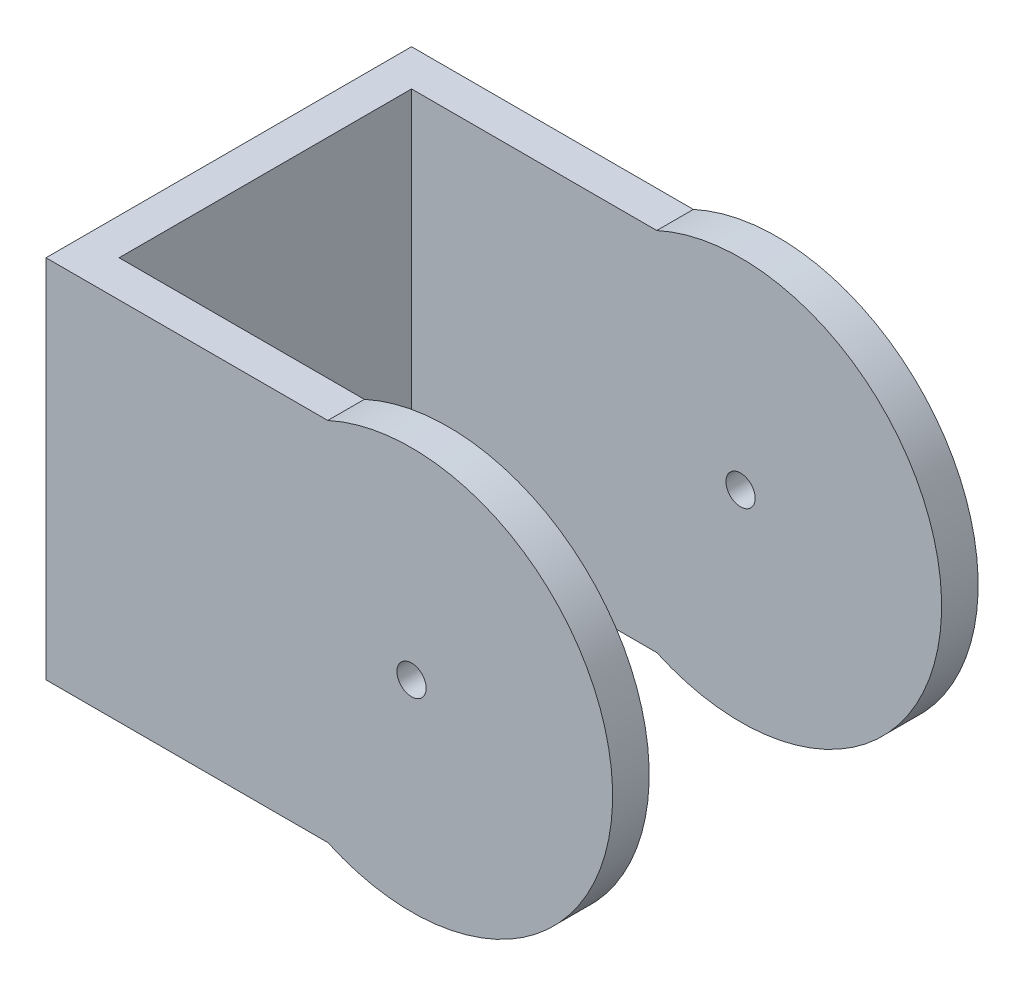
ISO-10303-21;
HEADER;
FILE_DESCRIPTION(('STEP AP214'),'2;1');
FILE_NAME('part.step','',(''),(''),'','','');
FILE_SCHEMA(('AUTOMOTIVE_DESIGN { 1 0 10303 214 1 1 1 1 }'));
ENDSEC;
DATA;
#1=APPLICATION_CONTEXT('core data for automotive mechanical design processes');
#2=APPLICATION_PROTOCOL_DEFINITION('international standard','automotive_design',2000,#1);
#3=PRODUCT_CONTEXT('',#1,'mechanical');
#4=PRODUCT('Part','Part','',(#3));
#5=PRODUCT_RELATED_PRODUCT_CATEGORY('part','',(#4));
#6=PRODUCT_DEFINITION_FORMATION('','',#4);
#7=PRODUCT_DEFINITION_CONTEXT('part definition',#1,'design');
#8=PRODUCT_DEFINITION('design','',#6,#7);
#9=PRODUCT_DEFINITION_SHAPE('','',#8);
#10=(LENGTH_UNIT() NAMED_UNIT(*) SI_UNIT(.MILLI.,.METRE.));
#11=(NAMED_UNIT(*) PLANE_ANGLE_UNIT() SI_UNIT($,.RADIAN.));
#12=(NAMED_UNIT(*) SI_UNIT($,.STERADIAN.) SOLID_ANGLE_UNIT());
#13=UNCERTAINTY_MEASURE_WITH_UNIT(LENGTH_MEASURE(1.E-05),#10,'distance_accuracy_value','');
#14=(GEOMETRIC_REPRESENTATION_CONTEXT(3) GLOBAL_UNCERTAINTY_ASSIGNED_CONTEXT((#13)) GLOBAL_UNIT_ASSIGNED_CONTEXT((#10,
#11,#12)) REPRESENTATION_CONTEXT('',''));
#15=CARTESIAN_POINT('',(0.,0.,0.));
#16=DIRECTION('',(0.,0.,1.));
#17=DIRECTION('',(1.,0.,0.));
#18=AXIS2_PLACEMENT_3D('',#15,#16,#17);
#19=CARTESIAN_POINT('',(-9.,0.,0.));
#20=DIRECTION('',(1.,0.,0.));
#21=DIRECTION('',(0.,1.,0.));
#22=AXIS2_PLACEMENT_3D('',#19,#20,#21);
#23=PLANE('',#22);
#24=CARTESIAN_POINT('',(-9.,0.,5.));
#25=DIRECTION('',(1.,0.,0.));
#26=DIRECTION('',(0.,1.,0.));
#27=AXIS2_PLACEMENT_3D('',#24,#25,#26);
#28=CIRCLE('',#27,0.4);
#29=CARTESIAN_POINT('',(-9.,0.399999999999999,5.));
#30=VERTEX_POINT('',#29);
#31=EDGE_CURVE('E323',#30,#30,#28,.T.);
#32=ORIENTED_EDGE('',*,*,#31,.F.);
#33=EDGE_LOOP('',(#32));
#34=FACE_BOUND('',#33,.T.);
#35=DIRECTION('',(0.,0.,1.));
#36=VECTOR('',#35,1.);
#37=CARTESIAN_POINT('',(-9.,-5.,10.));
#38=LINE('',#37,#36);
#39=CARTESIAN_POINT('',(-9.,-5.,0.999999999999999));
#40=VERTEX_POINT('',#39);
#41=CARTESIAN_POINT('',(-9.,-5.,9.));
#42=VERTEX_POINT('',#41);
#43=EDGE_CURVE('E133',#40,#42,#38,.T.);
#44=ORIENTED_EDGE('',*,*,#43,.F.);
#45=DIRECTION('',(0.,1.,0.));
#46=VECTOR('',#45,1.);
#47=CARTESIAN_POINT('',(-9.,0.,1.));
#48=LINE('',#47,#46);
#49=CARTESIAN_POINT('',(-9.,5.,1.));
#50=VERTEX_POINT('',#49);
#51=EDGE_CURVE('E11',#40,#50,#48,.T.);
#52=ORIENTED_EDGE('',*,*,#51,.T.);
#53=DIRECTION('',(0.,0.,-1.));
#54=VECTOR('',#53,1.);
#55=CARTESIAN_POINT('',(-9.,5.,0.));
#56=LINE('',#55,#54);
#57=CARTESIAN_POINT('',(-9.,5.,9.));
#58=VERTEX_POINT('',#57);
#59=EDGE_CURVE('E119',#58,#50,#56,.T.);
#60=ORIENTED_EDGE('',*,*,#59,.F.);
#61=DIRECTION('',(0.,1.,0.));
#62=VECTOR('',#61,1.);
#63=CARTESIAN_POINT('',(-9.,7.5,9.));
#64=LINE('',#63,#62);
#65=EDGE_CURVE('E46',#42,#58,#64,.T.);
#66=ORIENTED_EDGE('',*,*,#65,.F.);
#67=EDGE_LOOP('',(#44,#52,#60,#66));
#68=FACE_BOUND('',#67,.T.);
#69=ADVANCED_FACE('F38',(#34,#68),#23,.T.);
#70=CARTESIAN_POINT('',(0.,-5.,10.));
#71=DIRECTION('',(0.,1.,0.));
#72=DIRECTION('',(0.,0.,1.));
#73=AXIS2_PLACEMENT_3D('',#70,#71,#72);
#74=PLANE('',#73);
#75=DIRECTION('',(-1.,0.,0.));
#76=VECTOR('',#75,1.);
#77=CARTESIAN_POINT('',(-9.,-5.,0.));
#78=LINE('',#77,#76);
#79=CARTESIAN_POINT('',(-2.29128784747792,-5.,0.));
#80=VERTEX_POINT('',#79);
#81=CARTESIAN_POINT('',(-10.,-5.,0.));
#82=VERTEX_POINT('',#81);
#83=EDGE_CURVE('E136',#80,#82,#78,.T.);
#84=ORIENTED_EDGE('',*,*,#83,.F.);
#85=DIRECTION('',(0.,0.,-1.));
#86=VECTOR('',#85,1.);
#87=CARTESIAN_POINT('',(-2.29128784747792,-5.,10.));
#88=LINE('',#87,#86);
#89=CARTESIAN_POINT('',(-2.29128784747792,-5.,0.999999999999999));
#90=VERTEX_POINT('',#89);
#91=EDGE_CURVE('E125',#90,#80,#88,.T.);
#92=ORIENTED_EDGE('',*,*,#91,.F.);
#93=DIRECTION('',(-1.,0.,0.));
#94=VECTOR('',#93,1.);
#95=CARTESIAN_POINT('',(0.,-5.,0.999999999999999));
#96=LINE('',#95,#94);
#97=EDGE_CURVE('E105',#90,#40,#96,.T.);
#98=ORIENTED_EDGE('',*,*,#97,.T.);
#99=ORIENTED_EDGE('',*,*,#43,.T.);
#100=DIRECTION('',(1.,0.,0.));
#101=VECTOR('',#100,1.);
#102=CARTESIAN_POINT('',(0.,-5.,9.));
#103=LINE('',#102,#101);
#104=CARTESIAN_POINT('',(-2.29128784747792,-5.,9.));
#105=VERTEX_POINT('',#104);
#106=EDGE_CURVE('E61',#42,#105,#103,.T.);
#107=ORIENTED_EDGE('',*,*,#106,.T.);
#108=DIRECTION('',(0.,0.,-1.));
#109=VECTOR('',#108,1.);
#110=CARTESIAN_POINT('',(-2.29128784747792,-5.,10.));
#111=LINE('',#110,#109);
#112=CARTESIAN_POINT('',(-2.29128784747792,-5.,10.));
#113=VERTEX_POINT('',#112);
#114=EDGE_CURVE('E161',#113,#105,#111,.T.);
#115=ORIENTED_EDGE('',*,*,#114,.F.);
#116=DIRECTION('',(1.,0.,0.));
#117=VECTOR('',#116,1.);
#118=CARTESIAN_POINT('',(0.,-5.,10.));
#119=LINE('',#118,#117);
#120=CARTESIAN_POINT('',(-10.,-5.,10.));
#121=VERTEX_POINT('',#120);
#122=EDGE_CURVE('E154',#121,#113,#119,.T.);
#123=ORIENTED_EDGE('',*,*,#122,.F.);
#124=DIRECTION('',(0.,0.,-1.));
#125=VECTOR('',#124,1.);
#126=CARTESIAN_POINT('',(-10.,-5.,10.));
#127=LINE('',#126,#125);
#128=EDGE_CURVE('E141',#121,#82,#127,.T.);
#129=ORIENTED_EDGE('',*,*,#128,.T.);
#130=EDGE_LOOP('',(#84,#92,#98,#99,#107,#115,#123,#129));
#131=FACE_BOUND('',#130,.T.);
#132=ADVANCED_FACE('F40',(#131),#74,.F.);
#133=CARTESIAN_POINT('',(0.,0.,10.));
#134=DIRECTION('',(0.,0.,-1.));
#135=DIRECTION('',(-1.,0.,0.));
#136=AXIS2_PLACEMENT_3D('',#133,#134,#135);
#137=CYLINDRICAL_SURFACE('',#136,5.5);
#138=ORIENTED_EDGE('',*,*,#114,.T.);
#139=CARTESIAN_POINT('',(0.,0.,9.));
#140=DIRECTION('',(0.,0.,1.));
#141=DIRECTION('',(1.,0.,0.));
#142=AXIS2_PLACEMENT_3D('',#139,#140,#141);
#143=CIRCLE('',#142,5.5);
#144=CARTESIAN_POINT('',(-2.29128784747792,5.,9.));
#145=VERTEX_POINT('',#144);
#146=EDGE_CURVE('E151',#105,#145,#143,.T.);
#147=ORIENTED_EDGE('',*,*,#146,.T.);
#148=DIRECTION('',(0.,0.,-1.));
#149=VECTOR('',#148,1.);
#150=CARTESIAN_POINT('',(-2.29128784747792,5.,10.));
#151=LINE('',#150,#149);
#152=CARTESIAN_POINT('',(-2.29128784747792,5.,10.));
#153=VERTEX_POINT('',#152);
#154=EDGE_CURVE('E150',#153,#145,#151,.T.);
#155=ORIENTED_EDGE('',*,*,#154,.F.);
#156=CARTESIAN_POINT('',(0.,0.,10.));
#157=DIRECTION('',(0.,0.,1.));
#158=DIRECTION('',(1.,0.,0.));
#159=AXIS2_PLACEMENT_3D('',#156,#157,#158);
#160=CIRCLE('',#159,5.5);
#161=EDGE_CURVE('E147',#113,#153,#160,.T.);
#162=ORIENTED_EDGE('',*,*,#161,.F.);
#163=EDGE_LOOP('',(#138,#147,#155,#162));
#164=FACE_BOUND('',#163,.T.);
#165=ADVANCED_FACE('F183',(#164),#137,.T.);
#166=CARTESIAN_POINT('',(0.,5.,10.));
#167=DIRECTION('',(0.,1.,0.));
#168=DIRECTION('',(0.,0.,1.));
#169=AXIS2_PLACEMENT_3D('',#166,#167,#168);
#170=PLANE('',#169);
#171=DIRECTION('',(-1.,0.,0.));
#172=VECTOR('',#171,1.);
#173=CARTESIAN_POINT('',(-9.,5.,0.));
#174=LINE('',#173,#172);
#175=CARTESIAN_POINT('',(-2.29128784747792,5.,0.));
#176=VERTEX_POINT('',#175);
#177=CARTESIAN_POINT('',(-10.,5.,0.));
#178=VERTEX_POINT('',#177);
#179=EDGE_CURVE('E139',#176,#178,#174,.T.);
#180=ORIENTED_EDGE('',*,*,#179,.T.);
#181=DIRECTION('',(0.,0.,-1.));
#182=VECTOR('',#181,1.);
#183=CARTESIAN_POINT('',(-10.,5.,10.));
#184=LINE('',#183,#182);
#185=CARTESIAN_POINT('',(-10.,5.,10.));
#186=VERTEX_POINT('',#185);
#187=EDGE_CURVE('E156',#186,#178,#184,.T.);
#188=ORIENTED_EDGE('',*,*,#187,.F.);
#189=DIRECTION('',(1.,0.,0.));
#190=VECTOR('',#189,1.);
#191=CARTESIAN_POINT('',(0.,5.,10.));
#192=LINE('',#191,#190);
#193=EDGE_CURVE('E148',#186,#153,#192,.T.);
#194=ORIENTED_EDGE('',*,*,#193,.T.);
#195=ORIENTED_EDGE('',*,*,#154,.T.);
#196=DIRECTION('',(1.,0.,0.));
#197=VECTOR('',#196,1.);
#198=CARTESIAN_POINT('',(0.,5.,9.));
#199=LINE('',#198,#197);
#200=EDGE_CURVE('E164',#58,#145,#199,.T.);
#201=ORIENTED_EDGE('',*,*,#200,.F.);
#202=ORIENTED_EDGE('',*,*,#59,.T.);
#203=DIRECTION('',(-1.,0.,0.));
#204=VECTOR('',#203,1.);
#205=CARTESIAN_POINT('',(0.,5.,0.999999999999999));
#206=LINE('',#205,#204);
#207=CARTESIAN_POINT('',(-2.29128784747792,5.,0.999999999999999));
#208=VERTEX_POINT('',#207);
#209=EDGE_CURVE('E53',#208,#50,#206,.T.);
#210=ORIENTED_EDGE('',*,*,#209,.F.);
#211=DIRECTION('',(0.,0.,-1.));
#212=VECTOR('',#211,1.);
#213=CARTESIAN_POINT('',(-2.29128784747792,5.,10.));
#214=LINE('',#213,#212);
#215=EDGE_CURVE('E116',#208,#176,#214,.T.);
#216=ORIENTED_EDGE('',*,*,#215,.T.);
#217=EDGE_LOOP('',(#180,#188,#194,#195,#201,#202,#210,#216));
#218=FACE_BOUND('',#217,.T.);
#219=ADVANCED_FACE('F115',(#218),#170,.T.);
#220=CARTESIAN_POINT('',(0.,0.,10.));
#221=DIRECTION('',(0.,0.,-1.));
#222=DIRECTION('',(-1.,0.,0.));
#223=AXIS2_PLACEMENT_3D('',#220,#221,#222);
#224=CYLINDRICAL_SURFACE('',#223,0.4);
#225=CARTESIAN_POINT('',(0.,0.,9.));
#226=DIRECTION('',(0.,0.,1.));
#227=DIRECTION('',(1.,0.,0.));
#228=AXIS2_PLACEMENT_3D('',#225,#226,#227);
#229=CIRCLE('',#228,0.4);
#230=CARTESIAN_POINT('',(0.4,0.,9.));
#231=VERTEX_POINT('',#230);
#232=EDGE_CURVE('E146',#231,#231,#229,.T.);
#233=ORIENTED_EDGE('',*,*,#232,.F.);
#234=EDGE_LOOP('',(#233));
#235=FACE_BOUND('',#234,.T.);
#236=CARTESIAN_POINT('',(0.,0.,10.));
#237=DIRECTION('',(0.,0.,1.));
#238=DIRECTION('',(1.,0.,0.));
#239=AXIS2_PLACEMENT_3D('',#236,#237,#238);
#240=CIRCLE('',#239,0.4);
#241=CARTESIAN_POINT('',(0.4,0.,10.));
#242=VERTEX_POINT('',#241);
#243=EDGE_CURVE('E157',#242,#242,#240,.T.);
#244=ORIENTED_EDGE('',*,*,#243,.T.);
#245=EDGE_LOOP('',(#244));
#246=FACE_BOUND('',#245,.T.);
#247=ADVANCED_FACE('F215',(#235,#246),#224,.F.);
#248=CARTESIAN_POINT('',(-10.,0.,10.));
#249=DIRECTION('',(1.,0.,0.));
#250=DIRECTION('',(0.,1.,0.));
#251=AXIS2_PLACEMENT_3D('',#248,#249,#250);
#252=PLANE('',#251);
#253=CARTESIAN_POINT('',(-10.,0.,5.));
#254=DIRECTION('',(-1.,0.,0.));
#255=DIRECTION('',(0.,-1.,0.));
#256=AXIS2_PLACEMENT_3D('',#253,#254,#255);
#257=CIRCLE('',#256,0.4);
#258=CARTESIAN_POINT('',(-10.,-0.400000000000002,5.));
#259=VERTEX_POINT('',#258);
#260=EDGE_CURVE('E326',#259,#259,#257,.T.);
#261=ORIENTED_EDGE('',*,*,#260,.F.);
#262=EDGE_LOOP('',(#261));
#263=FACE_BOUND('',#262,.T.);
#264=DIRECTION('',(0.,-1.,0.));
#265=VECTOR('',#264,1.);
#266=CARTESIAN_POINT('',(-10.,-5.,0.));
#267=LINE('',#266,#265);
#268=EDGE_CURVE('E127',#178,#82,#267,.T.);
#269=ORIENTED_EDGE('',*,*,#268,.T.);
#270=ORIENTED_EDGE('',*,*,#128,.F.);
#271=DIRECTION('',(0.,-1.,0.));
#272=VECTOR('',#271,1.);
#273=CARTESIAN_POINT('',(-10.,0.,10.));
#274=LINE('',#273,#272);
#275=EDGE_CURVE('E144',#186,#121,#274,.T.);
#276=ORIENTED_EDGE('',*,*,#275,.F.);
#277=ORIENTED_EDGE('',*,*,#187,.T.);
#278=EDGE_LOOP('',(#269,#270,#276,#277));
#279=FACE_BOUND('',#278,.T.);
#280=ADVANCED_FACE('F191',(#263,#279),#252,.F.);
#281=CARTESIAN_POINT('',(0.,0.,10.));
#282=DIRECTION('',(0.,0.,1.));
#283=DIRECTION('',(1.,0.,0.));
#284=AXIS2_PLACEMENT_3D('',#281,#282,#283);
#285=PLANE('',#284);
#286=ORIENTED_EDGE('',*,*,#161,.T.);
#287=ORIENTED_EDGE('',*,*,#193,.F.);
#288=ORIENTED_EDGE('',*,*,#275,.T.);
#289=ORIENTED_EDGE('',*,*,#122,.T.);
#290=EDGE_LOOP('',(#286,#287,#288,#289));
#291=FACE_BOUND('',#290,.T.);
#292=ORIENTED_EDGE('',*,*,#243,.F.);
#293=EDGE_LOOP('',(#292));
#294=FACE_BOUND('',#293,.T.);
#295=ADVANCED_FACE('F187',(#291,#294),#285,.T.);
#296=CARTESIAN_POINT('',(9.,7.50000000000001,9.));
#297=DIRECTION('',(0.,0.,1.));
#298=DIRECTION('',(1.,0.,0.));
#299=AXIS2_PLACEMENT_3D('',#296,#297,#298);
#300=PLANE('',#299);
#301=ORIENTED_EDGE('',*,*,#232,.T.);
#302=EDGE_LOOP('',(#301));
#303=FACE_BOUND('',#302,.T.);
#304=ORIENTED_EDGE('',*,*,#106,.F.);
#305=ORIENTED_EDGE('',*,*,#65,.T.);
#306=ORIENTED_EDGE('',*,*,#200,.T.);
#307=ORIENTED_EDGE('',*,*,#146,.F.);
#308=EDGE_LOOP('',(#304,#305,#306,#307));
#309=FACE_BOUND('',#308,.T.);
#310=ADVANCED_FACE('F176',(#303,#309),#300,.F.);
#311=CARTESIAN_POINT('',(-9.,-5.,0.));
#312=DIRECTION('',(0.,0.,-1.));
#313=DIRECTION('',(-1.,0.,0.));
#314=AXIS2_PLACEMENT_3D('',#311,#312,#313);
#315=PLANE('',#314);
#316=ORIENTED_EDGE('',*,*,#268,.F.);
#317=ORIENTED_EDGE('',*,*,#179,.F.);
#318=CARTESIAN_POINT('',(0.,0.,0.));
#319=DIRECTION('',(0.,0.,1.));
#320=DIRECTION('',(1.,0.,0.));
#321=AXIS2_PLACEMENT_3D('',#318,#319,#320);
#322=CIRCLE('',#321,5.5);
#323=EDGE_CURVE('E124',#80,#176,#322,.T.);
#324=ORIENTED_EDGE('',*,*,#323,.F.);
#325=ORIENTED_EDGE('',*,*,#83,.T.);
#326=EDGE_LOOP('',(#316,#317,#324,#325));
#327=FACE_BOUND('',#326,.T.);
#328=CARTESIAN_POINT('',(0.,0.,0.));
#329=DIRECTION('',(0.,0.,1.));
#330=DIRECTION('',(1.,0.,0.));
#331=AXIS2_PLACEMENT_3D('',#328,#329,#330);
#332=CIRCLE('',#331,0.4);
#333=CARTESIAN_POINT('',(0.4,0.,0.));
#334=VERTEX_POINT('',#333);
#335=EDGE_CURVE('E129',#334,#334,#332,.T.);
#336=ORIENTED_EDGE('',*,*,#335,.T.);
#337=EDGE_LOOP('',(#336));
#338=FACE_BOUND('',#337,.T.);
#339=ADVANCED_FACE('F194',(#327,#338),#315,.T.);
#340=CARTESIAN_POINT('',(0.,0.,10.));
#341=DIRECTION('',(0.,0.,-1.));
#342=DIRECTION('',(-1.,0.,0.));
#343=AXIS2_PLACEMENT_3D('',#340,#341,#342);
#344=CYLINDRICAL_SURFACE('',#343,0.4);
#345=CARTESIAN_POINT('',(0.,0.,0.999999999999999));
#346=DIRECTION('',(0.,0.,-1.));
#347=DIRECTION('',(-1.,0.,0.));
#348=AXIS2_PLACEMENT_3D('',#345,#346,#347);
#349=CIRCLE('',#348,0.4);
#350=CARTESIAN_POINT('',(-0.4,0.,0.999999999999999));
#351=VERTEX_POINT('',#350);
#352=EDGE_CURVE('E120',#351,#351,#349,.T.);
#353=ORIENTED_EDGE('',*,*,#352,.F.);
#354=EDGE_LOOP('',(#353));
#355=FACE_BOUND('',#354,.T.);
#356=ORIENTED_EDGE('',*,*,#335,.F.);
#357=EDGE_LOOP('',(#356));
#358=FACE_BOUND('',#357,.T.);
#359=ADVANCED_FACE('F206',(#355,#358),#344,.F.);
#360=CARTESIAN_POINT('',(0.,0.,10.));
#361=DIRECTION('',(0.,0.,-1.));
#362=DIRECTION('',(-1.,0.,0.));
#363=AXIS2_PLACEMENT_3D('',#360,#361,#362);
#364=CYLINDRICAL_SURFACE('',#363,5.5);
#365=ORIENTED_EDGE('',*,*,#215,.F.);
#366=CARTESIAN_POINT('',(0.,0.,0.999999999999999));
#367=DIRECTION('',(0.,0.,-1.));
#368=DIRECTION('',(-1.,0.,0.));
#369=AXIS2_PLACEMENT_3D('',#366,#367,#368);
#370=CIRCLE('',#369,5.5);
#371=EDGE_CURVE('E101',#208,#90,#370,.T.);
#372=ORIENTED_EDGE('',*,*,#371,.T.);
#373=ORIENTED_EDGE('',*,*,#91,.T.);
#374=ORIENTED_EDGE('',*,*,#323,.T.);
#375=EDGE_LOOP('',(#365,#372,#373,#374));
#376=FACE_BOUND('',#375,.T.);
#377=ADVANCED_FACE('F122',(#376),#364,.T.);
#378=CARTESIAN_POINT('',(9.00000000000001,-7.49999999999999,1.));
#379=DIRECTION('',(0.,0.,-1.));
#380=DIRECTION('',(-1.,0.,0.));
#381=AXIS2_PLACEMENT_3D('',#378,#379,#380);
#382=PLANE('',#381);
#383=ORIENTED_EDGE('',*,*,#51,.F.);
#384=ORIENTED_EDGE('',*,*,#97,.F.);
#385=ORIENTED_EDGE('',*,*,#371,.F.);
#386=ORIENTED_EDGE('',*,*,#209,.T.);
#387=EDGE_LOOP('',(#383,#384,#385,#386));
#388=FACE_BOUND('',#387,.T.);
#389=ORIENTED_EDGE('',*,*,#352,.T.);
#390=EDGE_LOOP('',(#389));
#391=FACE_BOUND('',#390,.T.);
#392=ADVANCED_FACE('F102',(#388,#391),#382,.F.);
#393=CARTESIAN_POINT('',(-8.,0.,5.));
#394=DIRECTION('',(-1.,0.,0.));
#395=DIRECTION('',(0.,-1.,0.));
#396=AXIS2_PLACEMENT_3D('',#393,#394,#395);
#397=CYLINDRICAL_SURFACE('',#396,0.4);
#398=ORIENTED_EDGE('',*,*,#31,.T.);
#399=EDGE_LOOP('',(#398));
#400=FACE_BOUND('',#399,.T.);
#401=ORIENTED_EDGE('',*,*,#260,.T.);
#402=EDGE_LOOP('',(#401));
#403=FACE_BOUND('',#402,.T.);
#404=ADVANCED_FACE('F270',(#400,#403),#397,.F.);
#405=CLOSED_SHELL('',(#69,#132,#165,#219,#247,#280,#295,#310,#339,#359,#377,#392,#404));
#406=MANIFOLD_SOLID_BREP('B2',#405);
#407=ADVANCED_BREP_SHAPE_REPRESENTATION('',(#18,#406),#14);
#408=SHAPE_DEFINITION_REPRESENTATION(#9,#407);
ENDSEC;
END-ISO-10303-21;
